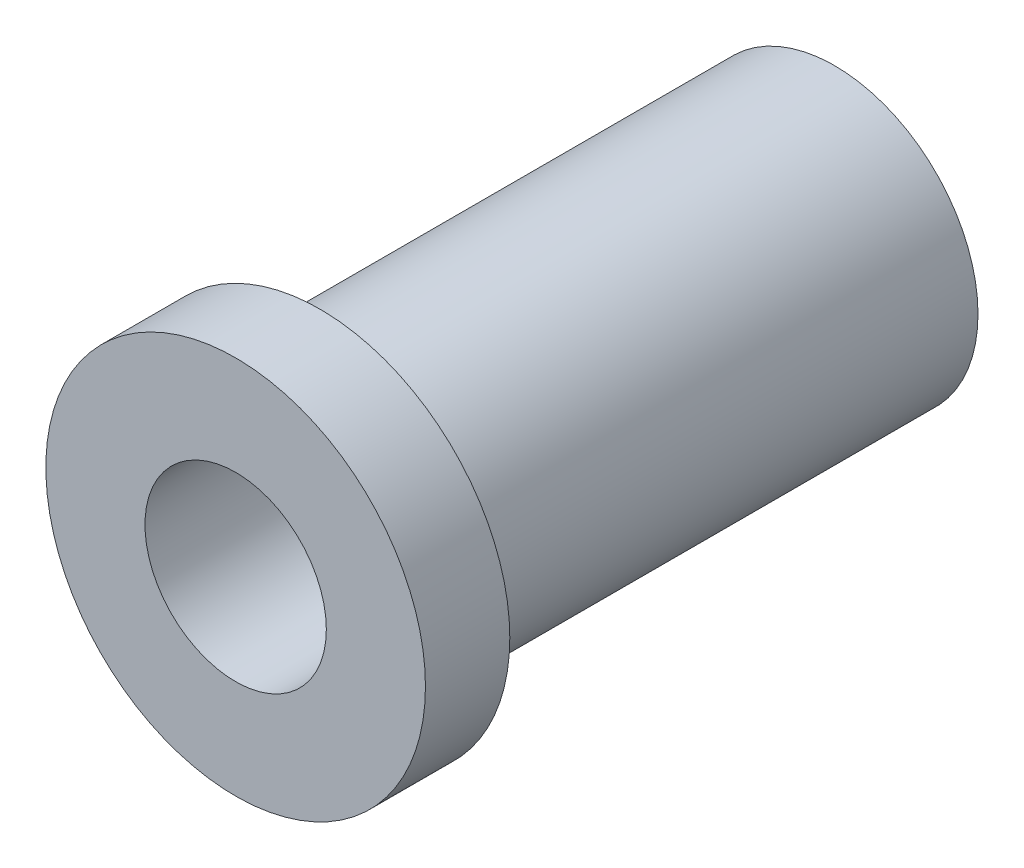
ISO-10303-21;
HEADER;
FILE_DESCRIPTION(('STEP AP214'),'2;1');
FILE_NAME('part.step','',(''),(''),'','','');
FILE_SCHEMA(('AUTOMOTIVE_DESIGN { 1 0 10303 214 1 1 1 1 }'));
ENDSEC;
DATA;
#1=APPLICATION_CONTEXT('core data for automotive mechanical design processes');
#2=APPLICATION_PROTOCOL_DEFINITION('international standard','automotive_design',2000,#1);
#3=PRODUCT_CONTEXT('',#1,'mechanical');
#4=PRODUCT('Part','Part','',(#3));
#5=PRODUCT_RELATED_PRODUCT_CATEGORY('part','',(#4));
#6=PRODUCT_DEFINITION_FORMATION('','',#4);
#7=PRODUCT_DEFINITION_CONTEXT('part definition',#1,'design');
#8=PRODUCT_DEFINITION('design','',#6,#7);
#9=PRODUCT_DEFINITION_SHAPE('','',#8);
#10=(LENGTH_UNIT() NAMED_UNIT(*) SI_UNIT(.MILLI.,.METRE.));
#11=(NAMED_UNIT(*) PLANE_ANGLE_UNIT() SI_UNIT($,.RADIAN.));
#12=(NAMED_UNIT(*) SI_UNIT($,.STERADIAN.) SOLID_ANGLE_UNIT());
#13=UNCERTAINTY_MEASURE_WITH_UNIT(LENGTH_MEASURE(1.E-05),#10,'distance_accuracy_value','');
#14=(GEOMETRIC_REPRESENTATION_CONTEXT(3) GLOBAL_UNCERTAINTY_ASSIGNED_CONTEXT((#13)) GLOBAL_UNIT_ASSIGNED_CONTEXT((#10,
#11,#12)) REPRESENTATION_CONTEXT('',''));
#15=CARTESIAN_POINT('',(0.,0.,0.));
#16=DIRECTION('',(0.,0.,1.));
#17=DIRECTION('',(1.,0.,0.));
#18=AXIS2_PLACEMENT_3D('',#15,#16,#17);
#19=CARTESIAN_POINT('',(0.,0.,12.2));
#20=DIRECTION('',(0.,0.,-1.));
#21=DIRECTION('',(-1.,0.,0.));
#22=AXIS2_PLACEMENT_3D('',#19,#20,#21);
#23=CYLINDRICAL_SURFACE('',#22,2.15);
#24=CARTESIAN_POINT('',(0.,0.,0.));
#25=DIRECTION('',(0.,0.,1.));
#26=DIRECTION('',(1.,0.,0.));
#27=AXIS2_PLACEMENT_3D('',#24,#25,#26);
#28=CIRCLE('',#27,2.15);
#29=CARTESIAN_POINT('',(2.15,0.,0.));
#30=VERTEX_POINT('',#29);
#31=EDGE_CURVE('E55',#30,#30,#28,.T.);
#32=ORIENTED_EDGE('',*,*,#31,.F.);
#33=EDGE_LOOP('',(#32));
#34=FACE_BOUND('',#33,.T.);
#35=CARTESIAN_POINT('',(0.,0.,14.2));
#36=DIRECTION('',(0.,0.,1.));
#37=DIRECTION('',(1.,0.,0.));
#38=AXIS2_PLACEMENT_3D('',#35,#36,#37);
#39=CIRCLE('',#38,2.15);
#40=CARTESIAN_POINT('',(2.15,0.,14.2));
#41=VERTEX_POINT('',#40);
#42=EDGE_CURVE('E61',#41,#41,#39,.T.);
#43=ORIENTED_EDGE('',*,*,#42,.T.);
#44=EDGE_LOOP('',(#43));
#45=FACE_BOUND('',#44,.T.);
#46=ADVANCED_FACE('F41',(#34,#45),#23,.F.);
#47=CARTESIAN_POINT('',(0.,0.,12.2));
#48=DIRECTION('',(0.,0.,-1.));
#49=DIRECTION('',(-1.,0.,0.));
#50=AXIS2_PLACEMENT_3D('',#47,#48,#49);
#51=CYLINDRICAL_SURFACE('',#50,3.4);
#52=CARTESIAN_POINT('',(0.,0.,12.2));
#53=DIRECTION('',(0.,0.,1.));
#54=DIRECTION('',(1.,0.,0.));
#55=AXIS2_PLACEMENT_3D('',#52,#53,#54);
#56=CIRCLE('',#55,3.4);
#57=CARTESIAN_POINT('',(3.4,0.,12.2));
#58=VERTEX_POINT('',#57);
#59=EDGE_CURVE('E10',#58,#58,#56,.T.);
#60=ORIENTED_EDGE('',*,*,#59,.F.);
#61=EDGE_LOOP('',(#60));
#62=FACE_BOUND('',#61,.T.);
#63=CARTESIAN_POINT('',(0.,0.,0.));
#64=DIRECTION('',(0.,0.,1.));
#65=DIRECTION('',(1.,0.,0.));
#66=AXIS2_PLACEMENT_3D('',#63,#64,#65);
#67=CIRCLE('',#66,3.4);
#68=CARTESIAN_POINT('',(3.4,0.,0.));
#69=VERTEX_POINT('',#68);
#70=EDGE_CURVE('E42',#69,#69,#67,.T.);
#71=ORIENTED_EDGE('',*,*,#70,.T.);
#72=EDGE_LOOP('',(#71));
#73=FACE_BOUND('',#72,.T.);
#74=ADVANCED_FACE('F85',(#62,#73),#51,.T.);
#75=CARTESIAN_POINT('',(0.,0.,0.));
#76=DIRECTION('',(0.,0.,1.));
#77=DIRECTION('',(1.,0.,0.));
#78=AXIS2_PLACEMENT_3D('',#75,#76,#77);
#79=PLANE('',#78);
#80=ORIENTED_EDGE('',*,*,#31,.T.);
#81=EDGE_LOOP('',(#80));
#82=FACE_BOUND('',#81,.T.);
#83=ORIENTED_EDGE('',*,*,#70,.F.);
#84=EDGE_LOOP('',(#83));
#85=FACE_BOUND('',#84,.T.);
#86=ADVANCED_FACE('F71',(#82,#85),#79,.F.);
#87=CARTESIAN_POINT('',(0.,0.,14.2));
#88=DIRECTION('',(0.,0.,1.));
#89=DIRECTION('',(1.,0.,0.));
#90=AXIS2_PLACEMENT_3D('',#87,#88,#89);
#91=PLANE('',#90);
#92=CARTESIAN_POINT('',(0.,0.,14.2));
#93=DIRECTION('',(0.,0.,1.));
#94=DIRECTION('',(1.,0.,0.));
#95=AXIS2_PLACEMENT_3D('',#92,#93,#94);
#96=CIRCLE('',#95,4.50000000000017);
#97=CARTESIAN_POINT('',(4.50000000000017,0.,14.2));
#98=VERTEX_POINT('',#97);
#99=EDGE_CURVE('E60',#98,#98,#96,.T.);
#100=ORIENTED_EDGE('',*,*,#99,.T.);
#101=EDGE_LOOP('',(#100));
#102=FACE_BOUND('',#101,.T.);
#103=ORIENTED_EDGE('',*,*,#42,.F.);
#104=EDGE_LOOP('',(#103));
#105=FACE_BOUND('',#104,.T.);
#106=ADVANCED_FACE('F66',(#102,#105),#91,.T.);
#107=CARTESIAN_POINT('',(0.,0.,12.2));
#108=DIRECTION('',(0.,0.,1.));
#109=DIRECTION('',(1.,0.,0.));
#110=AXIS2_PLACEMENT_3D('',#107,#108,#109);
#111=PLANE('',#110);
#112=ORIENTED_EDGE('',*,*,#59,.T.);
#113=EDGE_LOOP('',(#112));
#114=FACE_BOUND('',#113,.T.);
#115=CARTESIAN_POINT('',(0.,0.,12.2));
#116=DIRECTION('',(0.,0.,1.));
#117=DIRECTION('',(1.,0.,0.));
#118=AXIS2_PLACEMENT_3D('',#115,#116,#117);
#119=CIRCLE('',#118,4.50000000000017);
#120=CARTESIAN_POINT('',(4.50000000000017,0.,12.2));
#121=VERTEX_POINT('',#120);
#122=EDGE_CURVE('E53',#121,#121,#119,.T.);
#123=ORIENTED_EDGE('',*,*,#122,.F.);
#124=EDGE_LOOP('',(#123));
#125=FACE_BOUND('',#124,.T.);
#126=ADVANCED_FACE('F75',(#114,#125),#111,.F.);
#127=CARTESIAN_POINT('',(0.,0.,14.2));
#128=DIRECTION('',(0.,0.,-1.));
#129=DIRECTION('',(-1.,0.,0.));
#130=AXIS2_PLACEMENT_3D('',#127,#128,#129);
#131=CYLINDRICAL_SURFACE('',#130,4.50000000000017);
#132=ORIENTED_EDGE('',*,*,#99,.F.);
#133=EDGE_LOOP('',(#132));
#134=FACE_BOUND('',#133,.T.);
#135=ORIENTED_EDGE('',*,*,#122,.T.);
#136=EDGE_LOOP('',(#135));
#137=FACE_BOUND('',#136,.T.);
#138=ADVANCED_FACE('F76',(#134,#137),#131,.T.);
#139=CLOSED_SHELL('',(#46,#74,#86,#106,#126,#138));
#140=MANIFOLD_SOLID_BREP('B2',#139);
#141=ADVANCED_BREP_SHAPE_REPRESENTATION('',(#18,#140),#14);
#142=SHAPE_DEFINITION_REPRESENTATION(#9,#141);
ENDSEC;
END-ISO-10303-21;
